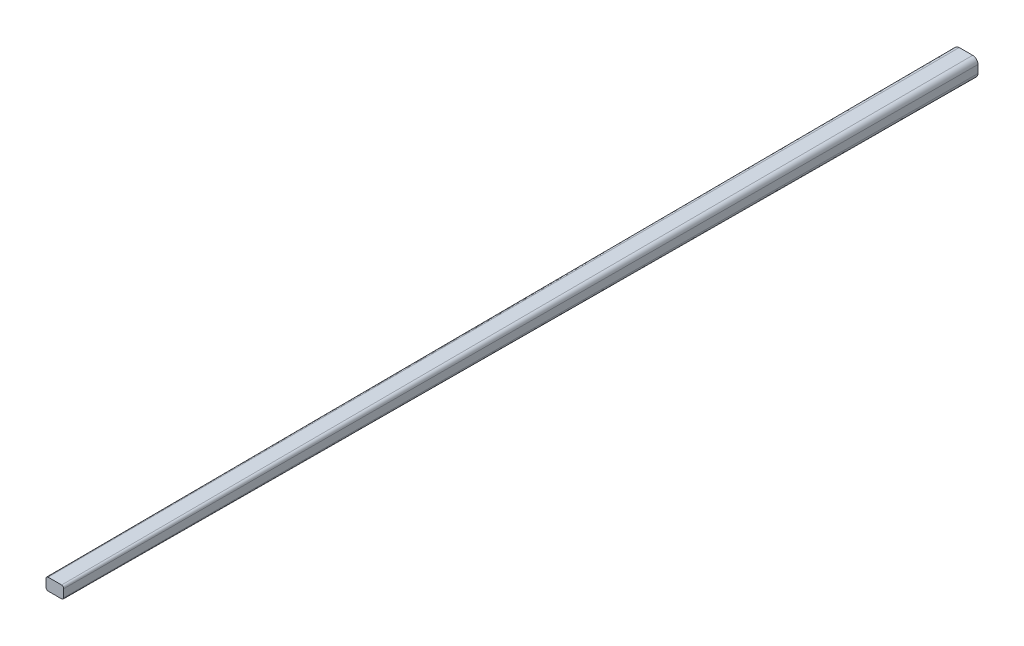
ISO-10303-21;
HEADER;
FILE_DESCRIPTION(('STEP AP214'),'2;1');
FILE_NAME('part.step','',(''),(''),'','','');
FILE_SCHEMA(('AUTOMOTIVE_DESIGN { 1 0 10303 214 1 1 1 1 }'));
ENDSEC;
DATA;
#1=APPLICATION_CONTEXT('core data for automotive mechanical design processes');
#2=APPLICATION_PROTOCOL_DEFINITION('international standard','automotive_design',2000,#1);
#3=PRODUCT_CONTEXT('',#1,'mechanical');
#4=PRODUCT('Part','Part','',(#3));
#5=PRODUCT_RELATED_PRODUCT_CATEGORY('part','',(#4));
#6=PRODUCT_DEFINITION_FORMATION('','',#4);
#7=PRODUCT_DEFINITION_CONTEXT('part definition',#1,'design');
#8=PRODUCT_DEFINITION('design','',#6,#7);
#9=PRODUCT_DEFINITION_SHAPE('','',#8);
#10=(LENGTH_UNIT() NAMED_UNIT(*) SI_UNIT(.MILLI.,.METRE.));
#11=(NAMED_UNIT(*) PLANE_ANGLE_UNIT() SI_UNIT($,.RADIAN.));
#12=(NAMED_UNIT(*) SI_UNIT($,.STERADIAN.) SOLID_ANGLE_UNIT());
#13=UNCERTAINTY_MEASURE_WITH_UNIT(LENGTH_MEASURE(1.E-05),#10,'distance_accuracy_value','');
#14=(GEOMETRIC_REPRESENTATION_CONTEXT(3) GLOBAL_UNCERTAINTY_ASSIGNED_CONTEXT((#13)) GLOBAL_UNIT_ASSIGNED_CONTEXT((#10,
#11,#12)) REPRESENTATION_CONTEXT('',''));
#15=CARTESIAN_POINT('',(0.,0.,0.));
#16=DIRECTION('',(0.,0.,1.));
#17=DIRECTION('',(1.,0.,0.));
#18=AXIS2_PLACEMENT_3D('',#15,#16,#17);
#19=CARTESIAN_POINT('',(-807.459430902871,-1279.43720216059,0.));
#20=DIRECTION('',(0.,0.,-1.));
#21=DIRECTION('',(1.,0.,0.));
#22=AXIS2_PLACEMENT_3D('',#19,#20,#21);
#23=CONICAL_SURFACE('',#22,1.50000000000006,0.00349065850398867);
#24=CARTESIAN_POINT('',(-807.459430902871,-1279.43720216059,0.));
#25=DIRECTION('',(0.,0.,1.));
#26=DIRECTION('',(1.,0.,0.));
#27=AXIS2_PLACEMENT_3D('',#24,#25,#26);
#28=CIRCLE('',#27,1.50000000000006);
#29=CARTESIAN_POINT('',(-807.459430902871,-1280.93720216059,0.));
#30=VERTEX_POINT('',#29);
#31=CARTESIAN_POINT('',(-805.959430902871,-1279.43720216059,0.));
#32=VERTEX_POINT('',#31);
#33=EDGE_CURVE('E109',#30,#32,#28,.T.);
#34=ORIENTED_EDGE('',*,*,#33,.T.);
#35=DIRECTION('',(0.00349065141522374,0.,-0.99999390765779));
#36=VECTOR('',#35,1.);
#37=CARTESIAN_POINT('',(-805.959430902871,-1279.43720216059,0.));
#38=LINE('',#37,#36);
#39=CARTESIAN_POINT('',(-806.856533782041,-1279.43720216059,257.));
#40=VERTEX_POINT('',#39);
#41=EDGE_CURVE('E11',#40,#32,#38,.T.);
#42=ORIENTED_EDGE('',*,*,#41,.F.);
#43=CARTESIAN_POINT('',(-807.459430902871,-1279.43720216059,257.));
#44=DIRECTION('',(0.,0.,1.));
#45=DIRECTION('',(1.,0.,0.));
#46=AXIS2_PLACEMENT_3D('',#43,#44,#45);
#47=CIRCLE('',#46,0.602897120829818);
#48=CARTESIAN_POINT('',(-807.459430902871,-1280.04009928142,257.));
#49=VERTEX_POINT('',#48);
#50=EDGE_CURVE('E134',#49,#40,#47,.T.);
#51=ORIENTED_EDGE('',*,*,#50,.F.);
#52=DIRECTION('',(0.,-0.00349065141522374,-0.99999390765779));
#53=VECTOR('',#52,1.);
#54=CARTESIAN_POINT('',(-807.459430902871,-1280.93720216059,0.));
#55=LINE('',#54,#53);
#56=EDGE_CURVE('E121',#49,#30,#55,.T.);
#57=ORIENTED_EDGE('',*,*,#56,.T.);
#58=EDGE_LOOP('',(#34,#42,#51,#57));
#59=FACE_BOUND('',#58,.T.);
#60=ADVANCED_FACE('F39',(#59),#23,.T.);
#61=CARTESIAN_POINT('',(-805.959430902871,0.,0.));
#62=DIRECTION('',(0.99999390765779,0.,0.00349065141522374));
#63=DIRECTION('',(0.00349065141522374,0.,-0.99999390765779));
#64=AXIS2_PLACEMENT_3D('',#61,#62,#63);
#65=PLANE('',#64);
#66=DIRECTION('',(0.,1.,0.));
#67=VECTOR('',#66,1.);
#68=CARTESIAN_POINT('',(-805.959430902871,0.,0.));
#69=LINE('',#68,#67);
#70=CARTESIAN_POINT('',(-805.959430902871,-1277.23720216059,0.));
#71=VERTEX_POINT('',#70);
#72=EDGE_CURVE('E105',#32,#71,#69,.T.);
#73=ORIENTED_EDGE('',*,*,#72,.T.);
#74=DIRECTION('',(0.00349065141522374,0.,-0.99999390765779));
#75=VECTOR('',#74,1.);
#76=CARTESIAN_POINT('',(-805.959430902871,-1277.23720216059,0.));
#77=LINE('',#76,#75);
#78=CARTESIAN_POINT('',(-806.856533782041,-1277.23720216059,257.));
#79=VERTEX_POINT('',#78);
#80=EDGE_CURVE('E48',#79,#71,#77,.T.);
#81=ORIENTED_EDGE('',*,*,#80,.F.);
#82=DIRECTION('',(0.,-1.,0.));
#83=VECTOR('',#82,1.);
#84=CARTESIAN_POINT('',(-806.856533782041,0.,257.));
#85=LINE('',#84,#83);
#86=EDGE_CURVE('E117',#40,#79,#85,.F.);
#87=ORIENTED_EDGE('',*,*,#86,.F.);
#88=ORIENTED_EDGE('',*,*,#41,.T.);
#89=EDGE_LOOP('',(#73,#81,#87,#88));
#90=FACE_BOUND('',#89,.T.);
#91=ADVANCED_FACE('F41',(#90),#65,.T.);
#92=CARTESIAN_POINT('',(-807.459430902871,-1277.23720216059,0.));
#93=DIRECTION('',(0.,0.,-1.));
#94=DIRECTION('',(1.,0.,0.));
#95=AXIS2_PLACEMENT_3D('',#92,#93,#94);
#96=CONICAL_SURFACE('',#95,1.50000000000006,0.00349065850398867);
#97=CARTESIAN_POINT('',(-807.459430902871,-1277.23720216059,0.));
#98=DIRECTION('',(0.,0.,1.));
#99=DIRECTION('',(1.,0.,0.));
#100=AXIS2_PLACEMENT_3D('',#97,#98,#99);
#101=CIRCLE('',#100,1.50000000000006);
#102=CARTESIAN_POINT('',(-807.459430902871,-1275.73720216059,0.));
#103=VERTEX_POINT('',#102);
#104=EDGE_CURVE('E111',#71,#103,#101,.T.);
#105=ORIENTED_EDGE('',*,*,#104,.T.);
#106=DIRECTION('',(0.,0.00349065141522374,-0.99999390765779));
#107=VECTOR('',#106,1.);
#108=CARTESIAN_POINT('',(-807.459430902871,-1275.73720216059,0.));
#109=LINE('',#108,#107);
#110=CARTESIAN_POINT('',(-807.459430902871,-1276.63430503976,257.));
#111=VERTEX_POINT('',#110);
#112=EDGE_CURVE('E149',#111,#103,#109,.T.);
#113=ORIENTED_EDGE('',*,*,#112,.F.);
#114=CARTESIAN_POINT('',(-807.459430902871,-1277.23720216059,257.));
#115=DIRECTION('',(0.,0.,1.));
#116=DIRECTION('',(1.,0.,0.));
#117=AXIS2_PLACEMENT_3D('',#114,#115,#116);
#118=CIRCLE('',#117,0.602897120829818);
#119=EDGE_CURVE('E155',#79,#111,#118,.T.);
#120=ORIENTED_EDGE('',*,*,#119,.F.);
#121=ORIENTED_EDGE('',*,*,#80,.T.);
#122=EDGE_LOOP('',(#105,#113,#120,#121));
#123=FACE_BOUND('',#122,.T.);
#124=ADVANCED_FACE('F178',(#123),#96,.T.);
#125=CARTESIAN_POINT('',(0.,-1275.73720216059,0.));
#126=DIRECTION('',(0.,0.99999390765779,0.00349065141522374));
#127=DIRECTION('',(0.,-0.00349065141522374,0.99999390765779));
#128=AXIS2_PLACEMENT_3D('',#125,#126,#127);
#129=PLANE('',#128);
#130=DIRECTION('',(-1.,0.,0.));
#131=VECTOR('',#130,1.);
#132=CARTESIAN_POINT('',(0.,-1275.73720216059,0.));
#133=LINE('',#132,#131);
#134=CARTESIAN_POINT('',(-811.259430902871,-1275.73720216059,0.));
#135=VERTEX_POINT('',#134);
#136=EDGE_CURVE('E125',#103,#135,#133,.T.);
#137=ORIENTED_EDGE('',*,*,#136,.T.);
#138=DIRECTION('',(0.,0.00349065141522374,-0.99999390765779));
#139=VECTOR('',#138,1.);
#140=CARTESIAN_POINT('',(-811.259430902871,-1275.73720216059,0.));
#141=LINE('',#140,#139);
#142=CARTESIAN_POINT('',(-811.259430902871,-1276.63430503976,257.));
#143=VERTEX_POINT('',#142);
#144=EDGE_CURVE('E146',#143,#135,#141,.T.);
#145=ORIENTED_EDGE('',*,*,#144,.F.);
#146=DIRECTION('',(1.,0.,0.));
#147=VECTOR('',#146,1.);
#148=CARTESIAN_POINT('',(0.,-1276.63430503976,257.));
#149=LINE('',#148,#147);
#150=EDGE_CURVE('E157',#111,#143,#149,.F.);
#151=ORIENTED_EDGE('',*,*,#150,.F.);
#152=ORIENTED_EDGE('',*,*,#112,.T.);
#153=EDGE_LOOP('',(#137,#145,#151,#152));
#154=FACE_BOUND('',#153,.T.);
#155=ADVANCED_FACE('F182',(#154),#129,.T.);
#156=CARTESIAN_POINT('',(-811.259430902871,-1277.23720216059,0.));
#157=DIRECTION('',(0.,0.,-1.));
#158=DIRECTION('',(1.,0.,0.));
#159=AXIS2_PLACEMENT_3D('',#156,#157,#158);
#160=CONICAL_SURFACE('',#159,1.5,0.00349065850398867);
#161=CARTESIAN_POINT('',(-811.259430902871,-1277.23720216059,0.));
#162=DIRECTION('',(0.,0.,1.));
#163=DIRECTION('',(1.,0.,0.));
#164=AXIS2_PLACEMENT_3D('',#161,#162,#163);
#165=CIRCLE('',#164,1.5);
#166=CARTESIAN_POINT('',(-812.759430902871,-1277.23720216059,0.));
#167=VERTEX_POINT('',#166);
#168=EDGE_CURVE('E127',#135,#167,#165,.T.);
#169=ORIENTED_EDGE('',*,*,#168,.T.);
#170=DIRECTION('',(-0.00349065141522374,0.,-0.99999390765779));
#171=VECTOR('',#170,1.);
#172=CARTESIAN_POINT('',(-812.759430902871,-1277.23720216059,0.));
#173=LINE('',#172,#171);
#174=CARTESIAN_POINT('',(-811.862328023701,-1277.23720216059,257.));
#175=VERTEX_POINT('',#174);
#176=EDGE_CURVE('E143',#175,#167,#173,.T.);
#177=ORIENTED_EDGE('',*,*,#176,.F.);
#178=CARTESIAN_POINT('',(-811.259430902871,-1277.23720216059,257.));
#179=DIRECTION('',(0.,0.,1.));
#180=DIRECTION('',(1.,0.,0.));
#181=AXIS2_PLACEMENT_3D('',#178,#179,#180);
#182=CIRCLE('',#181,0.602897120829763);
#183=EDGE_CURVE('E159',#143,#175,#182,.T.);
#184=ORIENTED_EDGE('',*,*,#183,.F.);
#185=ORIENTED_EDGE('',*,*,#144,.T.);
#186=EDGE_LOOP('',(#169,#177,#184,#185));
#187=FACE_BOUND('',#186,.T.);
#188=ADVANCED_FACE('F185',(#187),#160,.T.);
#189=CARTESIAN_POINT('',(-812.759430902871,0.,0.));
#190=DIRECTION('',(-0.99999390765779,0.,0.00349065141522374));
#191=DIRECTION('',(0.00349065141522374,0.,0.99999390765779));
#192=AXIS2_PLACEMENT_3D('',#189,#190,#191);
#193=PLANE('',#192);
#194=DIRECTION('',(0.,-1.,0.));
#195=VECTOR('',#194,1.);
#196=CARTESIAN_POINT('',(-812.759430902871,0.,0.));
#197=LINE('',#196,#195);
#198=CARTESIAN_POINT('',(-812.759430902871,-1279.43720216059,0.));
#199=VERTEX_POINT('',#198);
#200=EDGE_CURVE('E129',#167,#199,#197,.T.);
#201=ORIENTED_EDGE('',*,*,#200,.T.);
#202=DIRECTION('',(-0.00349065141522374,0.,-0.99999390765779));
#203=VECTOR('',#202,1.);
#204=CARTESIAN_POINT('',(-812.759430902871,-1279.43720216059,0.));
#205=LINE('',#204,#203);
#206=CARTESIAN_POINT('',(-811.862328023701,-1279.43720216059,257.));
#207=VERTEX_POINT('',#206);
#208=EDGE_CURVE('E140',#207,#199,#205,.T.);
#209=ORIENTED_EDGE('',*,*,#208,.F.);
#210=DIRECTION('',(0.,1.,0.));
#211=VECTOR('',#210,1.);
#212=CARTESIAN_POINT('',(-811.862328023701,0.,257.));
#213=LINE('',#212,#211);
#214=EDGE_CURVE('E161',#175,#207,#213,.F.);
#215=ORIENTED_EDGE('',*,*,#214,.F.);
#216=ORIENTED_EDGE('',*,*,#176,.T.);
#217=EDGE_LOOP('',(#201,#209,#215,#216));
#218=FACE_BOUND('',#217,.T.);
#219=ADVANCED_FACE('F168',(#218),#193,.T.);
#220=CARTESIAN_POINT('',(-811.259430902871,-1279.43720216059,0.));
#221=DIRECTION('',(0.,0.,-1.));
#222=DIRECTION('',(1.,0.,0.));
#223=AXIS2_PLACEMENT_3D('',#220,#221,#222);
#224=CONICAL_SURFACE('',#223,1.5,0.00349065850398867);
#225=CARTESIAN_POINT('',(-811.259430902871,-1279.43720216059,0.));
#226=DIRECTION('',(0.,0.,1.));
#227=DIRECTION('',(1.,0.,0.));
#228=AXIS2_PLACEMENT_3D('',#225,#226,#227);
#229=CIRCLE('',#228,1.5);
#230=CARTESIAN_POINT('',(-811.259430902871,-1280.93720216059,0.));
#231=VERTEX_POINT('',#230);
#232=EDGE_CURVE('E131',#199,#231,#229,.T.);
#233=ORIENTED_EDGE('',*,*,#232,.T.);
#234=DIRECTION('',(0.,-0.00349065141522374,-0.99999390765779));
#235=VECTOR('',#234,1.);
#236=CARTESIAN_POINT('',(-811.259430902871,-1280.93720216059,0.));
#237=LINE('',#236,#235);
#238=CARTESIAN_POINT('',(-811.259430902871,-1280.04009928142,257.));
#239=VERTEX_POINT('',#238);
#240=EDGE_CURVE('E137',#239,#231,#237,.T.);
#241=ORIENTED_EDGE('',*,*,#240,.F.);
#242=CARTESIAN_POINT('',(-811.259430902871,-1279.43720216059,257.));
#243=DIRECTION('',(0.,0.,1.));
#244=DIRECTION('',(1.,0.,0.));
#245=AXIS2_PLACEMENT_3D('',#242,#243,#244);
#246=CIRCLE('',#245,0.602897120829763);
#247=EDGE_CURVE('E60',#207,#239,#246,.T.);
#248=ORIENTED_EDGE('',*,*,#247,.F.);
#249=ORIENTED_EDGE('',*,*,#208,.T.);
#250=EDGE_LOOP('',(#233,#241,#248,#249));
#251=FACE_BOUND('',#250,.T.);
#252=ADVANCED_FACE('F172',(#251),#224,.T.);
#253=CARTESIAN_POINT('',(0.,-1280.93720216059,0.));
#254=DIRECTION('',(0.,-0.99999390765779,0.00349065141522374));
#255=DIRECTION('',(0.,-0.00349065141522374,-0.99999390765779));
#256=AXIS2_PLACEMENT_3D('',#253,#254,#255);
#257=PLANE('',#256);
#258=DIRECTION('',(1.,0.,0.));
#259=VECTOR('',#258,1.);
#260=CARTESIAN_POINT('',(0.,-1280.93720216059,0.));
#261=LINE('',#260,#259);
#262=EDGE_CURVE('E133',#231,#30,#261,.T.);
#263=ORIENTED_EDGE('',*,*,#262,.T.);
#264=ORIENTED_EDGE('',*,*,#56,.F.);
#265=DIRECTION('',(-1.,0.,0.));
#266=VECTOR('',#265,1.);
#267=CARTESIAN_POINT('',(0.,-1280.04009928142,257.));
#268=LINE('',#267,#266);
#269=EDGE_CURVE('E43',#239,#49,#268,.F.);
#270=ORIENTED_EDGE('',*,*,#269,.F.);
#271=ORIENTED_EDGE('',*,*,#240,.T.);
#272=EDGE_LOOP('',(#263,#264,#270,#271));
#273=FACE_BOUND('',#272,.T.);
#274=ADVANCED_FACE('F174',(#273),#257,.T.);
#275=CARTESIAN_POINT('',(0.,0.,257.));
#276=DIRECTION('',(0.,0.,1.));
#277=DIRECTION('',(1.,0.,0.));
#278=AXIS2_PLACEMENT_3D('',#275,#276,#277);
#279=PLANE('',#278);
#280=ORIENTED_EDGE('',*,*,#50,.T.);
#281=ORIENTED_EDGE('',*,*,#86,.T.);
#282=ORIENTED_EDGE('',*,*,#119,.T.);
#283=ORIENTED_EDGE('',*,*,#150,.T.);
#284=ORIENTED_EDGE('',*,*,#183,.T.);
#285=ORIENTED_EDGE('',*,*,#214,.T.);
#286=ORIENTED_EDGE('',*,*,#247,.T.);
#287=ORIENTED_EDGE('',*,*,#269,.T.);
#288=EDGE_LOOP('',(#280,#281,#282,#283,#284,#285,#286,#287));
#289=FACE_BOUND('',#288,.T.);
#290=ADVANCED_FACE('F164',(#289),#279,.T.);
#291=CARTESIAN_POINT('',(0.,0.,0.));
#292=DIRECTION('',(0.,0.,1.));
#293=DIRECTION('',(1.,0.,0.));
#294=AXIS2_PLACEMENT_3D('',#291,#292,#293);
#295=PLANE('',#294);
#296=ORIENTED_EDGE('',*,*,#33,.F.);
#297=ORIENTED_EDGE('',*,*,#262,.F.);
#298=ORIENTED_EDGE('',*,*,#232,.F.);
#299=ORIENTED_EDGE('',*,*,#200,.F.);
#300=ORIENTED_EDGE('',*,*,#168,.F.);
#301=ORIENTED_EDGE('',*,*,#136,.F.);
#302=ORIENTED_EDGE('',*,*,#104,.F.);
#303=ORIENTED_EDGE('',*,*,#72,.F.);
#304=EDGE_LOOP('',(#296,#297,#298,#299,#300,#301,#302,#303));
#305=FACE_BOUND('',#304,.T.);
#306=ADVANCED_FACE('F106',(#305),#295,.F.);
#307=CLOSED_SHELL('',(#60,#91,#124,#155,#188,#219,#252,#274,#290,#306));
#308=MANIFOLD_SOLID_BREP('B2',#307);
#309=ADVANCED_BREP_SHAPE_REPRESENTATION('',(#18,#308),#14);
#310=SHAPE_DEFINITION_REPRESENTATION(#9,#309);
ENDSEC;
END-ISO-10303-21;
